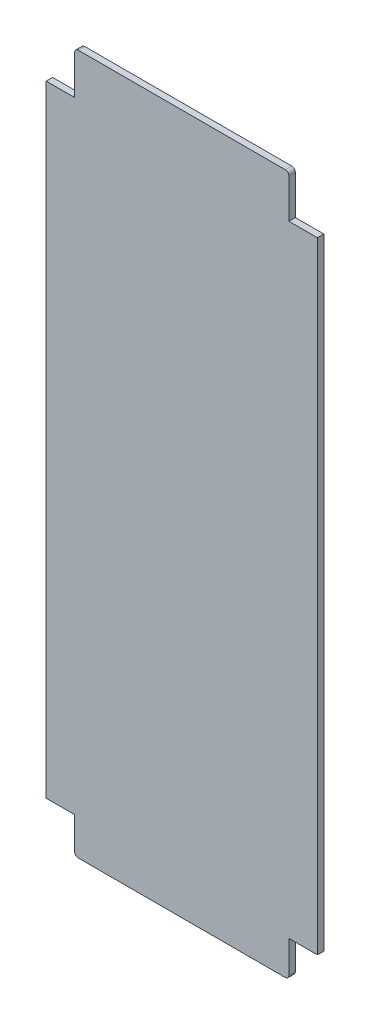
ISO-10303-21;
HEADER;
FILE_DESCRIPTION(('STEP AP214'),'2;1');
FILE_NAME('part.step','',(''),(''),'','','');
FILE_SCHEMA(('AUTOMOTIVE_DESIGN { 1 0 10303 214 1 1 1 1 }'));
ENDSEC;
DATA;
#1=APPLICATION_CONTEXT('core data for automotive mechanical design processes');
#2=APPLICATION_PROTOCOL_DEFINITION('international standard','automotive_design',2000,#1);
#3=PRODUCT_CONTEXT('',#1,'mechanical');
#4=PRODUCT('Part','Part','',(#3));
#5=PRODUCT_RELATED_PRODUCT_CATEGORY('part','',(#4));
#6=PRODUCT_DEFINITION_FORMATION('','',#4);
#7=PRODUCT_DEFINITION_CONTEXT('part definition',#1,'design');
#8=PRODUCT_DEFINITION('design','',#6,#7);
#9=PRODUCT_DEFINITION_SHAPE('','',#8);
#10=(LENGTH_UNIT() NAMED_UNIT(*) SI_UNIT(.MILLI.,.METRE.));
#11=(NAMED_UNIT(*) PLANE_ANGLE_UNIT() SI_UNIT($,.RADIAN.));
#12=(NAMED_UNIT(*) SI_UNIT($,.STERADIAN.) SOLID_ANGLE_UNIT());
#13=UNCERTAINTY_MEASURE_WITH_UNIT(LENGTH_MEASURE(1.E-05),#10,'distance_accuracy_value','');
#14=(GEOMETRIC_REPRESENTATION_CONTEXT(3) GLOBAL_UNCERTAINTY_ASSIGNED_CONTEXT((#13)) GLOBAL_UNIT_ASSIGNED_CONTEXT((#10,
#11,#12)) REPRESENTATION_CONTEXT('',''));
#15=CARTESIAN_POINT('',(0.,0.,0.));
#16=DIRECTION('',(0.,0.,1.));
#17=DIRECTION('',(1.,0.,0.));
#18=AXIS2_PLACEMENT_3D('',#15,#16,#17);
#19=CARTESIAN_POINT('',(29.,193.,-8.15));
#20=DIRECTION('',(0.,0.,-1.));
#21=DIRECTION('',(0.707106781186516,0.707106781186579,0.));
#22=AXIS2_PLACEMENT_3D('',#19,#20,#21);
#23=CYLINDRICAL_SURFACE('',#22,1.);
#24=CARTESIAN_POINT('',(29.,193.,-9.5));
#25=DIRECTION('',(0.,0.,1.));
#26=DIRECTION('',(0.707106781186516,0.707106781186579,0.));
#27=AXIS2_PLACEMENT_3D('',#24,#25,#26);
#28=CIRCLE('',#27,1.);
#29=CARTESIAN_POINT('',(30.,193.,-9.5));
#30=VERTEX_POINT('',#29);
#31=CARTESIAN_POINT('',(29.,194.,-9.5));
#32=VERTEX_POINT('',#31);
#33=EDGE_CURVE('E11',#30,#32,#28,.T.);
#34=ORIENTED_EDGE('',*,*,#33,.T.);
#35=DIRECTION('',(0.,0.,1.));
#36=VECTOR('',#35,1.);
#37=CARTESIAN_POINT('',(29.,194.,-8.15));
#38=LINE('',#37,#36);
#39=CARTESIAN_POINT('',(29.,194.,-7.7));
#40=VERTEX_POINT('',#39);
#41=EDGE_CURVE('E27',#32,#40,#38,.T.);
#42=ORIENTED_EDGE('',*,*,#41,.T.);
#43=CARTESIAN_POINT('',(29.,193.,-7.7));
#44=DIRECTION('',(0.,0.,-1.));
#45=DIRECTION('',(0.707106781186516,0.707106781186579,0.));
#46=AXIS2_PLACEMENT_3D('',#43,#44,#45);
#47=CIRCLE('',#46,1.);
#48=CARTESIAN_POINT('',(30.,193.,-7.7));
#49=VERTEX_POINT('',#48);
#50=EDGE_CURVE('E294',#40,#49,#47,.T.);
#51=ORIENTED_EDGE('',*,*,#50,.T.);
#52=DIRECTION('',(0.,0.,-1.));
#53=VECTOR('',#52,1.);
#54=CARTESIAN_POINT('',(30.,193.,-8.15));
#55=LINE('',#54,#53);
#56=EDGE_CURVE('E295',#49,#30,#55,.T.);
#57=ORIENTED_EDGE('',*,*,#56,.T.);
#58=EDGE_LOOP('',(#34,#42,#51,#57));
#59=FACE_BOUND('',#58,.T.);
#60=ADVANCED_FACE('F16',(#59),#23,.T.);
#61=CARTESIAN_POINT('',(0.,194.,-8.6));
#62=DIRECTION('',(0.,1.,0.));
#63=DIRECTION('',(1.,0.,0.));
#64=AXIS2_PLACEMENT_3D('',#61,#62,#63);
#65=PLANE('',#64);
#66=ORIENTED_EDGE('',*,*,#41,.F.);
#67=DIRECTION('',(-1.,0.,0.));
#68=VECTOR('',#67,1.);
#69=CARTESIAN_POINT('',(38.,194.,-9.5));
#70=LINE('',#69,#68);
#71=CARTESIAN_POINT('',(-29.,194.,-9.5));
#72=VERTEX_POINT('',#71);
#73=EDGE_CURVE('E297',#32,#72,#70,.T.);
#74=ORIENTED_EDGE('',*,*,#73,.T.);
#75=DIRECTION('',(0.,0.,-1.));
#76=VECTOR('',#75,1.);
#77=CARTESIAN_POINT('',(-29.,194.,-8.15));
#78=LINE('',#77,#76);
#79=CARTESIAN_POINT('',(-29.,194.,-7.7));
#80=VERTEX_POINT('',#79);
#81=EDGE_CURVE('E244',#80,#72,#78,.T.);
#82=ORIENTED_EDGE('',*,*,#81,.F.);
#83=DIRECTION('',(1.,0.,0.));
#84=VECTOR('',#83,1.);
#85=CARTESIAN_POINT('',(-38.,194.,-7.7));
#86=LINE('',#85,#84);
#87=EDGE_CURVE('E305',#80,#40,#86,.T.);
#88=ORIENTED_EDGE('',*,*,#87,.T.);
#89=EDGE_LOOP('',(#66,#74,#82,#88));
#90=FACE_BOUND('',#89,.T.);
#91=ADVANCED_FACE('F387',(#90),#65,.T.);
#92=CARTESIAN_POINT('',(38.,-2.,-9.5));
#93=DIRECTION('',(0.,0.,-1.));
#94=DIRECTION('',(0.,-1.,0.));
#95=AXIS2_PLACEMENT_3D('',#92,#93,#94);
#96=PLANE('',#95);
#97=ORIENTED_EDGE('',*,*,#33,.F.);
#98=DIRECTION('',(0.,-1.,0.));
#99=VECTOR('',#98,1.);
#100=CARTESIAN_POINT('',(30.,90.,-9.5));
#101=LINE('',#100,#99);
#102=CARTESIAN_POINT('',(30.,182.,-9.5));
#103=VERTEX_POINT('',#102);
#104=EDGE_CURVE('E288',#30,#103,#101,.T.);
#105=ORIENTED_EDGE('',*,*,#104,.T.);
#106=DIRECTION('',(1.,0.,0.));
#107=VECTOR('',#106,1.);
#108=CARTESIAN_POINT('',(38.,182.,-9.5));
#109=LINE('',#108,#107);
#110=CARTESIAN_POINT('',(38.,182.,-9.5));
#111=VERTEX_POINT('',#110);
#112=EDGE_CURVE('E237',#103,#111,#109,.T.);
#113=ORIENTED_EDGE('',*,*,#112,.T.);
#114=DIRECTION('',(0.,1.,0.));
#115=VECTOR('',#114,1.);
#116=CARTESIAN_POINT('',(38.,-2.,-9.5));
#117=LINE('',#116,#115);
#118=CARTESIAN_POINT('',(38.,8.,-9.5));
#119=VERTEX_POINT('',#118);
#120=EDGE_CURVE('E336',#119,#111,#117,.T.);
#121=ORIENTED_EDGE('',*,*,#120,.F.);
#122=DIRECTION('',(-1.,0.,0.));
#123=VECTOR('',#122,1.);
#124=CARTESIAN_POINT('',(34.,8.,-9.5));
#125=LINE('',#124,#123);
#126=CARTESIAN_POINT('',(30.,8.,-9.5));
#127=VERTEX_POINT('',#126);
#128=EDGE_CURVE('E233',#119,#127,#125,.T.);
#129=ORIENTED_EDGE('',*,*,#128,.T.);
#130=DIRECTION('',(0.,-1.,0.));
#131=VECTOR('',#130,1.);
#132=CARTESIAN_POINT('',(30.,-2.,-9.5));
#133=LINE('',#132,#131);
#134=CARTESIAN_POINT('',(30.,-1.,-9.5));
#135=VERTEX_POINT('',#134);
#136=EDGE_CURVE('E238',#127,#135,#133,.T.);
#137=ORIENTED_EDGE('',*,*,#136,.T.);
#138=CARTESIAN_POINT('',(29.,-1.,-9.5));
#139=DIRECTION('',(0.,0.,1.));
#140=DIRECTION('',(0.707106781186549,-0.707106781186546,0.));
#141=AXIS2_PLACEMENT_3D('',#138,#139,#140);
#142=CIRCLE('',#141,1.);
#143=CARTESIAN_POINT('',(29.,-2.,-9.5));
#144=VERTEX_POINT('',#143);
#145=EDGE_CURVE('E120',#144,#135,#142,.T.);
#146=ORIENTED_EDGE('',*,*,#145,.F.);
#147=DIRECTION('',(-1.,0.,0.));
#148=VECTOR('',#147,1.);
#149=CARTESIAN_POINT('',(38.,-2.,-9.5));
#150=LINE('',#149,#148);
#151=CARTESIAN_POINT('',(-29.,-2.,-9.5));
#152=VERTEX_POINT('',#151);
#153=EDGE_CURVE('E263',#144,#152,#150,.T.);
#154=ORIENTED_EDGE('',*,*,#153,.T.);
#155=CARTESIAN_POINT('',(-29.,-1.,-9.5));
#156=DIRECTION('',(0.,0.,1.));
#157=DIRECTION('',(-0.707106781186549,-0.707106781186546,0.));
#158=AXIS2_PLACEMENT_3D('',#155,#156,#157);
#159=CIRCLE('',#158,1.);
#160=CARTESIAN_POINT('',(-30.,-1.,-9.5));
#161=VERTEX_POINT('',#160);
#162=EDGE_CURVE('E189',#161,#152,#159,.T.);
#163=ORIENTED_EDGE('',*,*,#162,.F.);
#164=DIRECTION('',(0.,1.,0.));
#165=VECTOR('',#164,1.);
#166=CARTESIAN_POINT('',(-30.,3.,-9.5));
#167=LINE('',#166,#165);
#168=CARTESIAN_POINT('',(-30.,8.,-9.5));
#169=VERTEX_POINT('',#168);
#170=EDGE_CURVE('E255',#161,#169,#167,.T.);
#171=ORIENTED_EDGE('',*,*,#170,.T.);
#172=DIRECTION('',(-1.,0.,0.));
#173=VECTOR('',#172,1.);
#174=CARTESIAN_POINT('',(0.,8.,-9.5));
#175=LINE('',#174,#173);
#176=CARTESIAN_POINT('',(-38.,8.,-9.5));
#177=VERTEX_POINT('',#176);
#178=EDGE_CURVE('E251',#169,#177,#175,.T.);
#179=ORIENTED_EDGE('',*,*,#178,.T.);
#180=DIRECTION('',(0.,1.,0.));
#181=VECTOR('',#180,1.);
#182=CARTESIAN_POINT('',(-38.,-2.,-9.5));
#183=LINE('',#182,#181);
#184=CARTESIAN_POINT('',(-38.,182.,-9.5));
#185=VERTEX_POINT('',#184);
#186=EDGE_CURVE('E256',#177,#185,#183,.T.);
#187=ORIENTED_EDGE('',*,*,#186,.T.);
#188=DIRECTION('',(1.,0.,0.));
#189=VECTOR('',#188,1.);
#190=CARTESIAN_POINT('',(4.,182.,-9.5));
#191=LINE('',#190,#189);
#192=CARTESIAN_POINT('',(-30.,182.,-9.5));
#193=VERTEX_POINT('',#192);
#194=EDGE_CURVE('E299',#185,#193,#191,.T.);
#195=ORIENTED_EDGE('',*,*,#194,.T.);
#196=DIRECTION('',(0.,1.,0.));
#197=VECTOR('',#196,1.);
#198=CARTESIAN_POINT('',(-30.,96.,-9.5));
#199=LINE('',#198,#197);
#200=CARTESIAN_POINT('',(-30.,193.,-9.5));
#201=VERTEX_POINT('',#200);
#202=EDGE_CURVE('E243',#193,#201,#199,.T.);
#203=ORIENTED_EDGE('',*,*,#202,.T.);
#204=CARTESIAN_POINT('',(-29.,193.,-9.5));
#205=DIRECTION('',(0.,0.,1.));
#206=DIRECTION('',(-0.707106781186541,0.707106781186554,0.));
#207=AXIS2_PLACEMENT_3D('',#204,#205,#206);
#208=CIRCLE('',#207,1.);
#209=EDGE_CURVE('E291',#72,#201,#208,.T.);
#210=ORIENTED_EDGE('',*,*,#209,.F.);
#211=ORIENTED_EDGE('',*,*,#73,.F.);
#212=EDGE_LOOP('',(#97,#105,#113,#121,#129,#137,#146,#154,#163,#171,#179,#187,#195,#203,#210,#211));
#213=FACE_BOUND('',#212,.T.);
#214=ADVANCED_FACE('F363',(#213),#96,.T.);
#215=CARTESIAN_POINT('',(-29.,193.,-8.15));
#216=DIRECTION('',(0.,0.,1.));
#217=DIRECTION('',(-0.707106781186541,0.707106781186554,0.));
#218=AXIS2_PLACEMENT_3D('',#215,#216,#217);
#219=CYLINDRICAL_SURFACE('',#218,1.);
#220=CARTESIAN_POINT('',(-29.,193.,-7.7));
#221=DIRECTION('',(0.,0.,-1.));
#222=DIRECTION('',(-0.707106781186541,0.707106781186554,0.));
#223=AXIS2_PLACEMENT_3D('',#220,#221,#222);
#224=CIRCLE('',#223,1.);
#225=CARTESIAN_POINT('',(-30.,193.,-7.7));
#226=VERTEX_POINT('',#225);
#227=EDGE_CURVE('E239',#226,#80,#224,.T.);
#228=ORIENTED_EDGE('',*,*,#227,.T.);
#229=ORIENTED_EDGE('',*,*,#81,.T.);
#230=ORIENTED_EDGE('',*,*,#209,.T.);
#231=DIRECTION('',(0.,0.,1.));
#232=VECTOR('',#231,1.);
#233=CARTESIAN_POINT('',(-30.,193.,-8.15));
#234=LINE('',#233,#232);
#235=EDGE_CURVE('E200',#201,#226,#234,.T.);
#236=ORIENTED_EDGE('',*,*,#235,.T.);
#237=EDGE_LOOP('',(#228,#229,#230,#236));
#238=FACE_BOUND('',#237,.T.);
#239=ADVANCED_FACE('F396',(#238),#219,.T.);
#240=CARTESIAN_POINT('',(-30.,194.,-7.7));
#241=DIRECTION('',(1.,0.,0.));
#242=DIRECTION('',(0.,1.,0.));
#243=AXIS2_PLACEMENT_3D('',#240,#241,#242);
#244=PLANE('',#243);
#245=ORIENTED_EDGE('',*,*,#235,.F.);
#246=ORIENTED_EDGE('',*,*,#202,.F.);
#247=DIRECTION('',(0.,0.,-1.));
#248=VECTOR('',#247,1.);
#249=CARTESIAN_POINT('',(-30.,182.,-7.7));
#250=LINE('',#249,#248);
#251=CARTESIAN_POINT('',(-30.,182.,-7.7));
#252=VERTEX_POINT('',#251);
#253=EDGE_CURVE('E228',#252,#193,#250,.T.);
#254=ORIENTED_EDGE('',*,*,#253,.F.);
#255=DIRECTION('',(0.,-1.,0.));
#256=VECTOR('',#255,1.);
#257=CARTESIAN_POINT('',(-30.,96.,-7.7));
#258=LINE('',#257,#256);
#259=EDGE_CURVE('E229',#226,#252,#258,.T.);
#260=ORIENTED_EDGE('',*,*,#259,.F.);
#261=EDGE_LOOP('',(#245,#246,#254,#260));
#262=FACE_BOUND('',#261,.T.);
#263=ADVANCED_FACE('F399',(#262),#244,.F.);
#264=CARTESIAN_POINT('',(29.,-1.,-8.15));
#265=DIRECTION('',(0.,0.,1.));
#266=DIRECTION('',(0.707106781186549,-0.707106781186546,0.));
#267=AXIS2_PLACEMENT_3D('',#264,#265,#266);
#268=CYLINDRICAL_SURFACE('',#267,1.);
#269=CARTESIAN_POINT('',(29.,-1.,-7.7));
#270=DIRECTION('',(0.,0.,-1.));
#271=DIRECTION('',(0.707106781186549,-0.707106781186546,0.));
#272=AXIS2_PLACEMENT_3D('',#269,#270,#271);
#273=CIRCLE('',#272,1.);
#274=CARTESIAN_POINT('',(30.,-1.,-7.7));
#275=VERTEX_POINT('',#274);
#276=CARTESIAN_POINT('',(29.,-2.,-7.7));
#277=VERTEX_POINT('',#276);
#278=EDGE_CURVE('E184',#275,#277,#273,.T.);
#279=ORIENTED_EDGE('',*,*,#278,.T.);
#280=DIRECTION('',(0.,0.,-1.));
#281=VECTOR('',#280,1.);
#282=CARTESIAN_POINT('',(29.,-2.,-8.15));
#283=LINE('',#282,#281);
#284=EDGE_CURVE('E201',#277,#144,#283,.T.);
#285=ORIENTED_EDGE('',*,*,#284,.T.);
#286=ORIENTED_EDGE('',*,*,#145,.T.);
#287=DIRECTION('',(0.,0.,1.));
#288=VECTOR('',#287,1.);
#289=CARTESIAN_POINT('',(30.,-1.,-8.15));
#290=LINE('',#289,#288);
#291=EDGE_CURVE('E181',#135,#275,#290,.T.);
#292=ORIENTED_EDGE('',*,*,#291,.T.);
#293=EDGE_LOOP('',(#279,#285,#286,#292));
#294=FACE_BOUND('',#293,.T.);
#295=ADVANCED_FACE('F183',(#294),#268,.T.);
#296=CARTESIAN_POINT('',(30.,-2.,-7.7));
#297=DIRECTION('',(-1.,0.,0.));
#298=DIRECTION('',(0.,0.,1.));
#299=AXIS2_PLACEMENT_3D('',#296,#297,#298);
#300=PLANE('',#299);
#301=ORIENTED_EDGE('',*,*,#291,.F.);
#302=ORIENTED_EDGE('',*,*,#136,.F.);
#303=DIRECTION('',(0.,0.,-1.));
#304=VECTOR('',#303,1.);
#305=CARTESIAN_POINT('',(30.,8.,-7.7));
#306=LINE('',#305,#304);
#307=CARTESIAN_POINT('',(30.,8.,-7.7));
#308=VERTEX_POINT('',#307);
#309=EDGE_CURVE('E205',#308,#127,#306,.T.);
#310=ORIENTED_EDGE('',*,*,#309,.F.);
#311=DIRECTION('',(0.,1.,0.));
#312=VECTOR('',#311,1.);
#313=CARTESIAN_POINT('',(30.,-2.,-7.7));
#314=LINE('',#313,#312);
#315=EDGE_CURVE('E194',#275,#308,#314,.T.);
#316=ORIENTED_EDGE('',*,*,#315,.F.);
#317=EDGE_LOOP('',(#301,#302,#310,#316));
#318=FACE_BOUND('',#317,.T.);
#319=ADVANCED_FACE('F203',(#318),#300,.F.);
#320=CARTESIAN_POINT('',(-29.,-1.,-8.15));
#321=DIRECTION('',(0.,0.,-1.));
#322=DIRECTION('',(-0.707106781186549,-0.707106781186546,0.));
#323=AXIS2_PLACEMENT_3D('',#320,#321,#322);
#324=CYLINDRICAL_SURFACE('',#323,1.);
#325=ORIENTED_EDGE('',*,*,#162,.T.);
#326=DIRECTION('',(0.,0.,1.));
#327=VECTOR('',#326,1.);
#328=CARTESIAN_POINT('',(-29.,-2.,-8.15));
#329=LINE('',#328,#327);
#330=CARTESIAN_POINT('',(-29.,-2.,-7.7));
#331=VERTEX_POINT('',#330);
#332=EDGE_CURVE('E306',#152,#331,#329,.T.);
#333=ORIENTED_EDGE('',*,*,#332,.T.);
#334=CARTESIAN_POINT('',(-29.,-1.,-7.7));
#335=DIRECTION('',(0.,0.,-1.));
#336=DIRECTION('',(-0.707106781186549,-0.707106781186546,0.));
#337=AXIS2_PLACEMENT_3D('',#334,#335,#336);
#338=CIRCLE('',#337,1.);
#339=CARTESIAN_POINT('',(-30.,-1.,-7.7));
#340=VERTEX_POINT('',#339);
#341=EDGE_CURVE('E262',#331,#340,#338,.T.);
#342=ORIENTED_EDGE('',*,*,#341,.T.);
#343=DIRECTION('',(0.,0.,-1.));
#344=VECTOR('',#343,1.);
#345=CARTESIAN_POINT('',(-30.,-1.,-8.15));
#346=LINE('',#345,#344);
#347=EDGE_CURVE('E227',#340,#161,#346,.T.);
#348=ORIENTED_EDGE('',*,*,#347,.T.);
#349=EDGE_LOOP('',(#325,#333,#342,#348));
#350=FACE_BOUND('',#349,.T.);
#351=ADVANCED_FACE('F403',(#350),#324,.T.);
#352=CARTESIAN_POINT('',(-30.,8.,-7.7));
#353=DIRECTION('',(1.,0.,0.));
#354=DIRECTION('',(0.,1.,0.));
#355=AXIS2_PLACEMENT_3D('',#352,#353,#354);
#356=PLANE('',#355);
#357=ORIENTED_EDGE('',*,*,#347,.F.);
#358=DIRECTION('',(0.,-1.,0.));
#359=VECTOR('',#358,1.);
#360=CARTESIAN_POINT('',(-30.,3.,-7.7));
#361=LINE('',#360,#359);
#362=CARTESIAN_POINT('',(-30.,8.,-7.7));
#363=VERTEX_POINT('',#362);
#364=EDGE_CURVE('E214',#363,#340,#361,.T.);
#365=ORIENTED_EDGE('',*,*,#364,.F.);
#366=DIRECTION('',(0.,0.,-1.));
#367=VECTOR('',#366,1.);
#368=CARTESIAN_POINT('',(-30.,8.,-7.7));
#369=LINE('',#368,#367);
#370=EDGE_CURVE('E223',#363,#169,#369,.T.);
#371=ORIENTED_EDGE('',*,*,#370,.T.);
#372=ORIENTED_EDGE('',*,*,#170,.F.);
#373=EDGE_LOOP('',(#357,#365,#371,#372));
#374=FACE_BOUND('',#373,.T.);
#375=ADVANCED_FACE('F406',(#374),#356,.F.);
#376=CARTESIAN_POINT('',(-30.,182.,-7.7));
#377=DIRECTION('',(0.,-1.,0.));
#378=DIRECTION('',(0.,0.,-1.));
#379=AXIS2_PLACEMENT_3D('',#376,#377,#378);
#380=PLANE('',#379);
#381=ORIENTED_EDGE('',*,*,#194,.F.);
#382=DIRECTION('',(0.,0.,-1.));
#383=VECTOR('',#382,1.);
#384=CARTESIAN_POINT('',(-38.,182.,-8.6));
#385=LINE('',#384,#383);
#386=CARTESIAN_POINT('',(-38.,182.,-7.7));
#387=VERTEX_POINT('',#386);
#388=EDGE_CURVE('E89',#387,#185,#385,.T.);
#389=ORIENTED_EDGE('',*,*,#388,.F.);
#390=DIRECTION('',(-1.,0.,0.));
#391=VECTOR('',#390,1.);
#392=CARTESIAN_POINT('',(-34.,182.,-7.7));
#393=LINE('',#392,#391);
#394=EDGE_CURVE('E232',#252,#387,#393,.T.);
#395=ORIENTED_EDGE('',*,*,#394,.F.);
#396=ORIENTED_EDGE('',*,*,#253,.T.);
#397=EDGE_LOOP('',(#381,#389,#395,#396));
#398=FACE_BOUND('',#397,.T.);
#399=ADVANCED_FACE('F413',(#398),#380,.F.);
#400=CARTESIAN_POINT('',(-38.,8.,-7.7));
#401=DIRECTION('',(0.,1.,0.));
#402=DIRECTION('',(1.,0.,0.));
#403=AXIS2_PLACEMENT_3D('',#400,#401,#402);
#404=PLANE('',#403);
#405=ORIENTED_EDGE('',*,*,#178,.F.);
#406=ORIENTED_EDGE('',*,*,#370,.F.);
#407=DIRECTION('',(1.,0.,0.));
#408=VECTOR('',#407,1.);
#409=CARTESIAN_POINT('',(-38.,8.,-7.7));
#410=LINE('',#409,#408);
#411=CARTESIAN_POINT('',(-38.,8.,-7.7));
#412=VERTEX_POINT('',#411);
#413=EDGE_CURVE('E316',#412,#363,#410,.T.);
#414=ORIENTED_EDGE('',*,*,#413,.F.);
#415=DIRECTION('',(0.,0.,1.));
#416=VECTOR('',#415,1.);
#417=CARTESIAN_POINT('',(-38.,8.,-8.6));
#418=LINE('',#417,#416);
#419=EDGE_CURVE('E77',#177,#412,#418,.T.);
#420=ORIENTED_EDGE('',*,*,#419,.F.);
#421=EDGE_LOOP('',(#405,#406,#414,#420));
#422=FACE_BOUND('',#421,.T.);
#423=ADVANCED_FACE('F410',(#422),#404,.F.);
#424=CARTESIAN_POINT('',(38.,182.,-7.7));
#425=DIRECTION('',(0.,-1.,0.));
#426=DIRECTION('',(0.,0.,-1.));
#427=AXIS2_PLACEMENT_3D('',#424,#425,#426);
#428=PLANE('',#427);
#429=ORIENTED_EDGE('',*,*,#112,.F.);
#430=DIRECTION('',(0.,0.,-1.));
#431=VECTOR('',#430,1.);
#432=CARTESIAN_POINT('',(30.,182.,-7.7));
#433=LINE('',#432,#431);
#434=CARTESIAN_POINT('',(30.,182.,-7.7));
#435=VERTEX_POINT('',#434);
#436=EDGE_CURVE('E245',#435,#103,#433,.T.);
#437=ORIENTED_EDGE('',*,*,#436,.F.);
#438=DIRECTION('',(-1.,0.,0.));
#439=VECTOR('',#438,1.);
#440=CARTESIAN_POINT('',(0.,182.,-7.7));
#441=LINE('',#440,#439);
#442=CARTESIAN_POINT('',(38.,182.,-7.7));
#443=VERTEX_POINT('',#442);
#444=EDGE_CURVE('E265',#443,#435,#441,.T.);
#445=ORIENTED_EDGE('',*,*,#444,.F.);
#446=DIRECTION('',(0.,0.,1.));
#447=VECTOR('',#446,1.);
#448=CARTESIAN_POINT('',(38.,182.,-7.7));
#449=LINE('',#448,#447);
#450=EDGE_CURVE('E219',#111,#443,#449,.T.);
#451=ORIENTED_EDGE('',*,*,#450,.F.);
#452=EDGE_LOOP('',(#429,#437,#445,#451));
#453=FACE_BOUND('',#452,.T.);
#454=ADVANCED_FACE('F369',(#453),#428,.F.);
#455=CARTESIAN_POINT('',(30.,182.,-7.7));
#456=DIRECTION('',(-1.,0.,0.));
#457=DIRECTION('',(0.,0.,1.));
#458=AXIS2_PLACEMENT_3D('',#455,#456,#457);
#459=PLANE('',#458);
#460=ORIENTED_EDGE('',*,*,#56,.F.);
#461=DIRECTION('',(0.,1.,0.));
#462=VECTOR('',#461,1.);
#463=CARTESIAN_POINT('',(30.,90.,-7.7));
#464=LINE('',#463,#462);
#465=EDGE_CURVE('E267',#435,#49,#464,.T.);
#466=ORIENTED_EDGE('',*,*,#465,.F.);
#467=ORIENTED_EDGE('',*,*,#436,.T.);
#468=ORIENTED_EDGE('',*,*,#104,.F.);
#469=EDGE_LOOP('',(#460,#466,#467,#468));
#470=FACE_BOUND('',#469,.T.);
#471=ADVANCED_FACE('F367',(#470),#459,.F.);
#472=CARTESIAN_POINT('',(30.,8.,-7.7));
#473=DIRECTION('',(0.,1.,0.));
#474=DIRECTION('',(1.,0.,0.));
#475=AXIS2_PLACEMENT_3D('',#472,#473,#474);
#476=PLANE('',#475);
#477=ORIENTED_EDGE('',*,*,#128,.F.);
#478=DIRECTION('',(0.,0.,-1.));
#479=VECTOR('',#478,1.);
#480=CARTESIAN_POINT('',(38.,8.,-7.7));
#481=LINE('',#480,#479);
#482=CARTESIAN_POINT('',(38.,8.,-7.7));
#483=VERTEX_POINT('',#482);
#484=EDGE_CURVE('E282',#483,#119,#481,.T.);
#485=ORIENTED_EDGE('',*,*,#484,.F.);
#486=DIRECTION('',(1.,0.,0.));
#487=VECTOR('',#486,1.);
#488=CARTESIAN_POINT('',(-4.,8.,-7.7));
#489=LINE('',#488,#487);
#490=EDGE_CURVE('E20',#308,#483,#489,.T.);
#491=ORIENTED_EDGE('',*,*,#490,.F.);
#492=ORIENTED_EDGE('',*,*,#309,.T.);
#493=EDGE_LOOP('',(#477,#485,#491,#492));
#494=FACE_BOUND('',#493,.T.);
#495=ADVANCED_FACE('F375',(#494),#476,.F.);
#496=CARTESIAN_POINT('',(-38.,-2.,-7.7));
#497=DIRECTION('',(0.,0.,1.));
#498=DIRECTION('',(1.,0.,0.));
#499=AXIS2_PLACEMENT_3D('',#496,#497,#498);
#500=PLANE('',#499);
#501=ORIENTED_EDGE('',*,*,#50,.F.);
#502=ORIENTED_EDGE('',*,*,#87,.F.);
#503=ORIENTED_EDGE('',*,*,#227,.F.);
#504=ORIENTED_EDGE('',*,*,#259,.T.);
#505=ORIENTED_EDGE('',*,*,#394,.T.);
#506=DIRECTION('',(0.,1.,0.));
#507=VECTOR('',#506,1.);
#508=CARTESIAN_POINT('',(-38.,-2.,-7.7));
#509=LINE('',#508,#507);
#510=EDGE_CURVE('E221',#412,#387,#509,.T.);
#511=ORIENTED_EDGE('',*,*,#510,.F.);
#512=ORIENTED_EDGE('',*,*,#413,.T.);
#513=ORIENTED_EDGE('',*,*,#364,.T.);
#514=ORIENTED_EDGE('',*,*,#341,.F.);
#515=DIRECTION('',(1.,0.,0.));
#516=VECTOR('',#515,1.);
#517=CARTESIAN_POINT('',(-38.,-2.,-7.7));
#518=LINE('',#517,#516);
#519=EDGE_CURVE('E198',#331,#277,#518,.T.);
#520=ORIENTED_EDGE('',*,*,#519,.T.);
#521=ORIENTED_EDGE('',*,*,#278,.F.);
#522=ORIENTED_EDGE('',*,*,#315,.T.);
#523=ORIENTED_EDGE('',*,*,#490,.T.);
#524=DIRECTION('',(0.,1.,0.));
#525=VECTOR('',#524,1.);
#526=CARTESIAN_POINT('',(38.,-2.,-7.7));
#527=LINE('',#526,#525);
#528=EDGE_CURVE('E216',#483,#443,#527,.T.);
#529=ORIENTED_EDGE('',*,*,#528,.T.);
#530=ORIENTED_EDGE('',*,*,#444,.T.);
#531=ORIENTED_EDGE('',*,*,#465,.T.);
#532=EDGE_LOOP('',(#501,#502,#503,#504,#505,#511,#512,#513,#514,#520,#521,#522,#523,#529,#530,#531));
#533=FACE_BOUND('',#532,.T.);
#534=ADVANCED_FACE('F192',(#533),#500,.T.);
#535=CARTESIAN_POINT('',(38.,-2.,-7.7));
#536=DIRECTION('',(1.,0.,0.));
#537=DIRECTION('',(0.,1.,0.));
#538=AXIS2_PLACEMENT_3D('',#535,#536,#537);
#539=PLANE('',#538);
#540=ORIENTED_EDGE('',*,*,#450,.T.);
#541=ORIENTED_EDGE('',*,*,#528,.F.);
#542=ORIENTED_EDGE('',*,*,#484,.T.);
#543=ORIENTED_EDGE('',*,*,#120,.T.);
#544=EDGE_LOOP('',(#540,#541,#542,#543));
#545=FACE_BOUND('',#544,.T.);
#546=ADVANCED_FACE('F372',(#545),#539,.T.);
#547=CARTESIAN_POINT('',(-38.,-2.,-9.5));
#548=DIRECTION('',(-1.,0.,0.));
#549=DIRECTION('',(0.,0.,1.));
#550=AXIS2_PLACEMENT_3D('',#547,#548,#549);
#551=PLANE('',#550);
#552=ORIENTED_EDGE('',*,*,#388,.T.);
#553=ORIENTED_EDGE('',*,*,#186,.F.);
#554=ORIENTED_EDGE('',*,*,#419,.T.);
#555=ORIENTED_EDGE('',*,*,#510,.T.);
#556=EDGE_LOOP('',(#552,#553,#554,#555));
#557=FACE_BOUND('',#556,.T.);
#558=ADVANCED_FACE('F18',(#557),#551,.T.);
#559=CARTESIAN_POINT('',(0.,-2.,-8.6));
#560=DIRECTION('',(0.,1.,0.));
#561=DIRECTION('',(1.,0.,0.));
#562=AXIS2_PLACEMENT_3D('',#559,#560,#561);
#563=PLANE('',#562);
#564=ORIENTED_EDGE('',*,*,#284,.F.);
#565=ORIENTED_EDGE('',*,*,#519,.F.);
#566=ORIENTED_EDGE('',*,*,#332,.F.);
#567=ORIENTED_EDGE('',*,*,#153,.F.);
#568=EDGE_LOOP('',(#564,#565,#566,#567));
#569=FACE_BOUND('',#568,.T.);
#570=ADVANCED_FACE('F421',(#569),#563,.F.);
#571=CLOSED_SHELL('',(#60,#91,#214,#239,#263,#295,#319,#351,#375,#399,#423,#454,#471,#495,#534,
#546,#558,#570));
#572=MANIFOLD_SOLID_BREP('B1',#571);
#573=ADVANCED_BREP_SHAPE_REPRESENTATION('',(#18,#572),#14);
#574=SHAPE_DEFINITION_REPRESENTATION(#9,#573);
ENDSEC;
END-ISO-10303-21;
